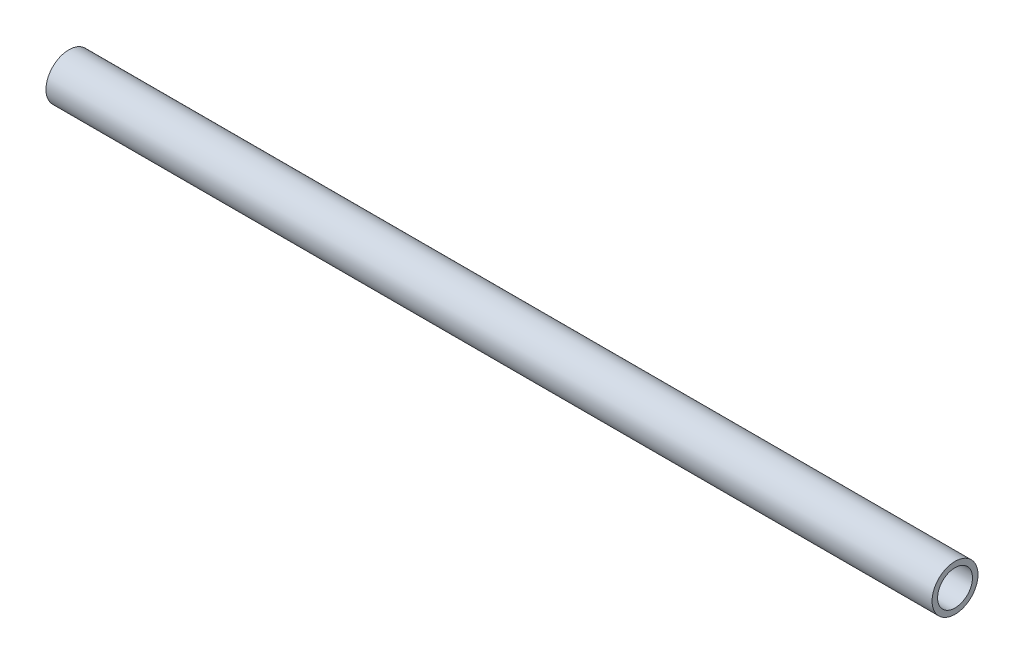
ISO-10303-21;
HEADER;
FILE_DESCRIPTION(('STEP AP214'),'2;1');
FILE_NAME('part.step','',(''),(''),'','','');
FILE_SCHEMA(('AUTOMOTIVE_DESIGN { 1 0 10303 214 1 1 1 1 }'));
ENDSEC;
DATA;
#1=APPLICATION_CONTEXT('core data for automotive mechanical design processes');
#2=APPLICATION_PROTOCOL_DEFINITION('international standard','automotive_design',2000,#1);
#3=PRODUCT_CONTEXT('',#1,'mechanical');
#4=PRODUCT('Part','Part','',(#3));
#5=PRODUCT_RELATED_PRODUCT_CATEGORY('part','',(#4));
#6=PRODUCT_DEFINITION_FORMATION('','',#4);
#7=PRODUCT_DEFINITION_CONTEXT('part definition',#1,'design');
#8=PRODUCT_DEFINITION('design','',#6,#7);
#9=PRODUCT_DEFINITION_SHAPE('','',#8);
#10=(LENGTH_UNIT() NAMED_UNIT(*) SI_UNIT(.MILLI.,.METRE.));
#11=(NAMED_UNIT(*) PLANE_ANGLE_UNIT() SI_UNIT($,.RADIAN.));
#12=(NAMED_UNIT(*) SI_UNIT($,.STERADIAN.) SOLID_ANGLE_UNIT());
#13=UNCERTAINTY_MEASURE_WITH_UNIT(LENGTH_MEASURE(1.E-05),#10,'distance_accuracy_value','');
#14=(GEOMETRIC_REPRESENTATION_CONTEXT(3) GLOBAL_UNCERTAINTY_ASSIGNED_CONTEXT((#13)) GLOBAL_UNIT_ASSIGNED_CONTEXT((#10,
#11,#12)) REPRESENTATION_CONTEXT('',''));
#15=CARTESIAN_POINT('',(0.,0.,0.));
#16=DIRECTION('',(0.,0.,1.));
#17=DIRECTION('',(1.,0.,0.));
#18=AXIS2_PLACEMENT_3D('',#15,#16,#17);
#19=CARTESIAN_POINT('',(490.,0.,0.));
#20=DIRECTION('',(1.,0.,0.));
#21=DIRECTION('',(0.,0.,-1.));
#22=AXIS2_PLACEMENT_3D('',#19,#20,#21);
#23=PLANE('',#22);
#24=CARTESIAN_POINT('',(490.,0.,0.));
#25=DIRECTION('',(1.,0.,0.));
#26=DIRECTION('',(0.,0.,-1.));
#27=AXIS2_PLACEMENT_3D('',#24,#25,#26);
#28=CIRCLE('',#27,12.7);
#29=CARTESIAN_POINT('',(490.,0.,-12.7));
#30=VERTEX_POINT('',#29);
#31=EDGE_CURVE('E10',#30,#30,#28,.T.);
#32=ORIENTED_EDGE('',*,*,#31,.T.);
#33=EDGE_LOOP('',(#32));
#34=FACE_BOUND('',#33,.T.);
#35=CARTESIAN_POINT('',(490.,0.,0.));
#36=DIRECTION('',(1.,0.,0.));
#37=DIRECTION('',(0.,0.,-1.));
#38=AXIS2_PLACEMENT_3D('',#35,#36,#37);
#39=CIRCLE('',#38,9.652);
#40=CARTESIAN_POINT('',(490.,0.,-9.652));
#41=VERTEX_POINT('',#40);
#42=EDGE_CURVE('E45',#41,#41,#39,.T.);
#43=ORIENTED_EDGE('',*,*,#42,.F.);
#44=EDGE_LOOP('',(#43));
#45=FACE_BOUND('',#44,.T.);
#46=ADVANCED_FACE('F34',(#34,#45),#23,.T.);
#47=CARTESIAN_POINT('',(0.,0.,0.));
#48=DIRECTION('',(1.,0.,0.));
#49=DIRECTION('',(0.,0.,-1.));
#50=AXIS2_PLACEMENT_3D('',#47,#48,#49);
#51=PLANE('',#50);
#52=CARTESIAN_POINT('',(0.,0.,0.));
#53=DIRECTION('',(1.,0.,0.));
#54=DIRECTION('',(0.,0.,-1.));
#55=AXIS2_PLACEMENT_3D('',#52,#53,#54);
#56=CIRCLE('',#55,12.7);
#57=CARTESIAN_POINT('',(0.,0.,-12.7));
#58=VERTEX_POINT('',#57);
#59=EDGE_CURVE('E38',#58,#58,#56,.T.);
#60=ORIENTED_EDGE('',*,*,#59,.F.);
#61=EDGE_LOOP('',(#60));
#62=FACE_BOUND('',#61,.T.);
#63=CARTESIAN_POINT('',(0.,0.,0.));
#64=DIRECTION('',(1.,0.,0.));
#65=DIRECTION('',(0.,0.,-1.));
#66=AXIS2_PLACEMENT_3D('',#63,#64,#65);
#67=CIRCLE('',#66,9.652);
#68=CARTESIAN_POINT('',(0.,0.,-9.652));
#69=VERTEX_POINT('',#68);
#70=EDGE_CURVE('E47',#69,#69,#67,.T.);
#71=ORIENTED_EDGE('',*,*,#70,.T.);
#72=EDGE_LOOP('',(#71));
#73=FACE_BOUND('',#72,.T.);
#74=ADVANCED_FACE('F57',(#62,#73),#51,.F.);
#75=CARTESIAN_POINT('',(490.,0.,0.));
#76=DIRECTION('',(-1.,0.,0.));
#77=DIRECTION('',(0.,0.,1.));
#78=AXIS2_PLACEMENT_3D('',#75,#76,#77);
#79=CYLINDRICAL_SURFACE('',#78,12.7);
#80=ORIENTED_EDGE('',*,*,#31,.F.);
#81=EDGE_LOOP('',(#80));
#82=FACE_BOUND('',#81,.T.);
#83=ORIENTED_EDGE('',*,*,#59,.T.);
#84=EDGE_LOOP('',(#83));
#85=FACE_BOUND('',#84,.T.);
#86=ADVANCED_FACE('F36',(#82,#85),#79,.T.);
#87=CARTESIAN_POINT('',(490.,0.,0.));
#88=DIRECTION('',(-1.,0.,0.));
#89=DIRECTION('',(0.,0.,1.));
#90=AXIS2_PLACEMENT_3D('',#87,#88,#89);
#91=CYLINDRICAL_SURFACE('',#90,9.652);
#92=ORIENTED_EDGE('',*,*,#42,.T.);
#93=EDGE_LOOP('',(#92));
#94=FACE_BOUND('',#93,.T.);
#95=ORIENTED_EDGE('',*,*,#70,.F.);
#96=EDGE_LOOP('',(#95));
#97=FACE_BOUND('',#96,.T.);
#98=ADVANCED_FACE('F53',(#94,#97),#91,.F.);
#99=CLOSED_SHELL('',(#46,#74,#86,#98));
#100=MANIFOLD_SOLID_BREP('B2',#99);
#101=ADVANCED_BREP_SHAPE_REPRESENTATION('',(#18,#100),#14);
#102=SHAPE_DEFINITION_REPRESENTATION(#9,#101);
ENDSEC;
END-ISO-10303-21;
